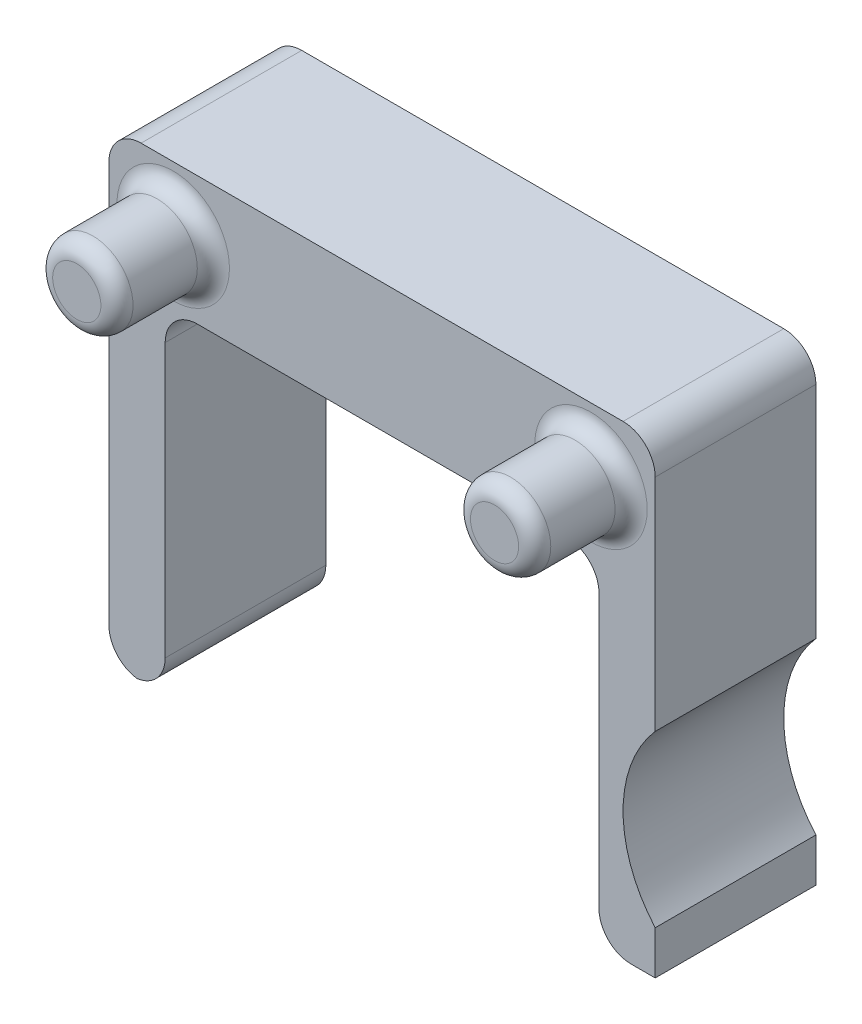
ISO-10303-21;
HEADER;
FILE_DESCRIPTION(('STEP AP214'),'2;1');
FILE_NAME('part.step','',(''),(''),'','','');
FILE_SCHEMA(('AUTOMOTIVE_DESIGN { 1 0 10303 214 1 1 1 1 }'));
ENDSEC;
DATA;
#1=APPLICATION_CONTEXT('core data for automotive mechanical design processes');
#2=APPLICATION_PROTOCOL_DEFINITION('international standard','automotive_design',2000,#1);
#3=PRODUCT_CONTEXT('',#1,'mechanical');
#4=PRODUCT('Part','Part','',(#3));
#5=PRODUCT_RELATED_PRODUCT_CATEGORY('part','',(#4));
#6=PRODUCT_DEFINITION_FORMATION('','',#4);
#7=PRODUCT_DEFINITION_CONTEXT('part definition',#1,'design');
#8=PRODUCT_DEFINITION('design','',#6,#7);
#9=PRODUCT_DEFINITION_SHAPE('','',#8);
#10=(LENGTH_UNIT() NAMED_UNIT(*) SI_UNIT(.MILLI.,.METRE.));
#11=(NAMED_UNIT(*) PLANE_ANGLE_UNIT() SI_UNIT($,.RADIAN.));
#12=(NAMED_UNIT(*) SI_UNIT($,.STERADIAN.) SOLID_ANGLE_UNIT());
#13=UNCERTAINTY_MEASURE_WITH_UNIT(LENGTH_MEASURE(1.E-05),#10,'distance_accuracy_value','');
#14=(GEOMETRIC_REPRESENTATION_CONTEXT(3) GLOBAL_UNCERTAINTY_ASSIGNED_CONTEXT((#13)) GLOBAL_UNIT_ASSIGNED_CONTEXT((#10,
#11,#12)) REPRESENTATION_CONTEXT('',''));
#15=CARTESIAN_POINT('',(0.,0.,0.));
#16=DIRECTION('',(0.,0.,1.));
#17=DIRECTION('',(1.,0.,0.));
#18=AXIS2_PLACEMENT_3D('',#15,#16,#17);
#19=CARTESIAN_POINT('',(10.1036821705426,-4.88441860465116,5.));
#20=DIRECTION('',(0.,0.,1.));
#21=DIRECTION('',(1.,0.,0.));
#22=AXIS2_PLACEMENT_3D('',#19,#20,#21);
#23=PLANE('',#22);
#24=CARTESIAN_POINT('',(5.10368217054263,3.61558139534884,5.));
#25=DIRECTION('',(0.,0.,1.));
#26=DIRECTION('',(1.,0.,0.));
#27=AXIS2_PLACEMENT_3D('',#24,#25,#26);
#28=CIRCLE('',#27,1.75);
#29=CARTESIAN_POINT('',(6.85368217054263,3.61558139534884,5.));
#30=VERTEX_POINT('',#29);
#31=EDGE_CURVE('E11',#30,#30,#28,.F.);
#32=ORIENTED_EDGE('',*,*,#31,.T.);
#33=EDGE_LOOP('',(#32));
#34=FACE_BOUND('',#33,.T.);
#35=CARTESIAN_POINT('',(-7.89631782945737,3.61558139534884,5.));
#36=DIRECTION('',(0.,0.,1.));
#37=DIRECTION('',(1.,0.,0.));
#38=AXIS2_PLACEMENT_3D('',#35,#36,#37);
#39=CIRCLE('',#38,1.75);
#40=CARTESIAN_POINT('',(-6.14631782945737,3.61558139534884,5.));
#41=VERTEX_POINT('',#40);
#42=EDGE_CURVE('E52',#41,#41,#39,.F.);
#43=ORIENTED_EDGE('',*,*,#42,.T.);
#44=EDGE_LOOP('',(#43));
#45=FACE_BOUND('',#44,.T.);
#46=DIRECTION('',(-1.,0.,0.));
#47=VECTOR('',#46,1.);
#48=CARTESIAN_POINT('',(-9.89631782945736,5.61558139534884,5.));
#49=LINE('',#48,#47);
#50=CARTESIAN_POINT('',(6.10368217054263,5.61558139534884,5.));
#51=VERTEX_POINT('',#50);
#52=CARTESIAN_POINT('',(-8.89631782945736,5.61558139534884,5.));
#53=VERTEX_POINT('',#52);
#54=EDGE_CURVE('E198',#51,#53,#49,.T.);
#55=ORIENTED_EDGE('',*,*,#54,.T.);
#56=CARTESIAN_POINT('',(-8.89631782945736,4.61558139534884,5.));
#57=DIRECTION('',(0.,0.,1.));
#58=DIRECTION('',(1.,0.,0.));
#59=AXIS2_PLACEMENT_3D('',#56,#57,#58);
#60=CIRCLE('',#59,1.);
#61=CARTESIAN_POINT('',(-9.89631782945736,4.61558139534884,5.));
#62=VERTEX_POINT('',#61);
#63=EDGE_CURVE('E284',#53,#62,#60,.T.);
#64=ORIENTED_EDGE('',*,*,#63,.T.);
#65=DIRECTION('',(0.,-1.,0.));
#66=VECTOR('',#65,1.);
#67=CARTESIAN_POINT('',(-9.89631782945736,-8.88441860465116,5.));
#68=LINE('',#67,#66);
#69=CARTESIAN_POINT('',(-9.89631782945736,-7.88441860465116,5.));
#70=VERTEX_POINT('',#69);
#71=EDGE_CURVE('E201',#62,#70,#68,.T.);
#72=ORIENTED_EDGE('',*,*,#71,.T.);
#73=CARTESIAN_POINT('',(-8.89631782945736,-7.88441860465116,5.));
#74=DIRECTION('',(0.,0.,1.));
#75=DIRECTION('',(1.,0.,0.));
#76=AXIS2_PLACEMENT_3D('',#73,#74,#75);
#77=CIRCLE('',#76,1.);
#78=CARTESIAN_POINT('',(-9.02131782945735,-8.87657534630038,5.));
#79=VERTEX_POINT('',#78);
#80=EDGE_CURVE('E59',#70,#79,#77,.T.);
#81=ORIENTED_EDGE('',*,*,#80,.T.);
#82=CARTESIAN_POINT('',(-9.14631782945736,-7.88441860465116,5.));
#83=DIRECTION('',(0.,0.,1.));
#84=DIRECTION('',(1.,0.,0.));
#85=AXIS2_PLACEMENT_3D('',#82,#83,#84);
#86=CIRCLE('',#85,1.);
#87=CARTESIAN_POINT('',(-8.14631782945736,-7.88441860465116,5.));
#88=VERTEX_POINT('',#87);
#89=EDGE_CURVE('E276',#79,#88,#86,.T.);
#90=ORIENTED_EDGE('',*,*,#89,.T.);
#91=DIRECTION('',(0.,1.,0.));
#92=VECTOR('',#91,1.);
#93=CARTESIAN_POINT('',(-8.14631782945736,1.61558139534884,5.));
#94=LINE('',#93,#92);
#95=CARTESIAN_POINT('',(-8.14631782945736,0.615581395348841,5.));
#96=VERTEX_POINT('',#95);
#97=EDGE_CURVE('E204',#88,#96,#94,.T.);
#98=ORIENTED_EDGE('',*,*,#97,.T.);
#99=CARTESIAN_POINT('',(-7.14631782945736,0.615581395348841,5.));
#100=DIRECTION('',(0.,0.,1.));
#101=DIRECTION('',(1.,0.,0.));
#102=AXIS2_PLACEMENT_3D('',#99,#100,#101);
#103=CIRCLE('',#102,1.);
#104=CARTESIAN_POINT('',(-7.14631782945736,1.61558139534884,5.));
#105=VERTEX_POINT('',#104);
#106=EDGE_CURVE('E316',#96,#105,#103,.F.);
#107=ORIENTED_EDGE('',*,*,#106,.T.);
#108=DIRECTION('',(1.,0.,0.));
#109=VECTOR('',#108,1.);
#110=CARTESIAN_POINT('',(5.35368217054264,1.61558139534884,5.));
#111=LINE('',#110,#109);
#112=CARTESIAN_POINT('',(4.35368217054264,1.61558139534884,5.));
#113=VERTEX_POINT('',#112);
#114=EDGE_CURVE('E240',#105,#113,#111,.T.);
#115=ORIENTED_EDGE('',*,*,#114,.T.);
#116=CARTESIAN_POINT('',(4.35368217054264,0.615581395348841,5.));
#117=DIRECTION('',(0.,0.,1.));
#118=DIRECTION('',(1.,0.,0.));
#119=AXIS2_PLACEMENT_3D('',#116,#117,#118);
#120=CIRCLE('',#119,1.);
#121=CARTESIAN_POINT('',(5.35368217054264,0.615581395348841,5.));
#122=VERTEX_POINT('',#121);
#123=EDGE_CURVE('E322',#113,#122,#120,.F.);
#124=ORIENTED_EDGE('',*,*,#123,.T.);
#125=DIRECTION('',(0.,-1.,0.));
#126=VECTOR('',#125,1.);
#127=CARTESIAN_POINT('',(5.35368217054264,-8.88441860465116,5.));
#128=LINE('',#127,#126);
#129=CARTESIAN_POINT('',(5.35368217054264,-7.88441860465116,5.));
#130=VERTEX_POINT('',#129);
#131=EDGE_CURVE('E171',#122,#130,#128,.T.);
#132=ORIENTED_EDGE('',*,*,#131,.T.);
#133=CARTESIAN_POINT('',(6.35368217054264,-7.88441860465116,5.));
#134=DIRECTION('',(0.,0.,1.));
#135=DIRECTION('',(1.,0.,0.));
#136=AXIS2_PLACEMENT_3D('',#133,#134,#135);
#137=CIRCLE('',#136,1.);
#138=CARTESIAN_POINT('',(6.35368217054263,-8.88441860465116,5.));
#139=VERTEX_POINT('',#138);
#140=EDGE_CURVE('E166',#130,#139,#137,.T.);
#141=ORIENTED_EDGE('',*,*,#140,.T.);
#142=DIRECTION('',(1.,0.,0.));
#143=VECTOR('',#142,1.);
#144=CARTESIAN_POINT('',(7.10368217054264,-8.88441860465116,5.));
#145=LINE('',#144,#143);
#146=CARTESIAN_POINT('',(7.10368217054264,-8.88441860465116,5.));
#147=VERTEX_POINT('',#146);
#148=EDGE_CURVE('E158',#139,#147,#145,.T.);
#149=ORIENTED_EDGE('',*,*,#148,.T.);
#150=DIRECTION('',(0.,1.,0.));
#151=VECTOR('',#150,1.);
#152=CARTESIAN_POINT('',(7.10368217054263,-7.53016991571575,5.));
#153=LINE('',#152,#151);
#154=CARTESIAN_POINT('',(7.10368217054263,-7.53016991571575,5.));
#155=VERTEX_POINT('',#154);
#156=EDGE_CURVE('E162',#147,#155,#153,.T.);
#157=ORIENTED_EDGE('',*,*,#156,.T.);
#158=CARTESIAN_POINT('',(10.1036821705426,-4.88441860465116,5.));
#159=DIRECTION('',(0.,0.,-1.));
#160=DIRECTION('',(1.,0.,0.));
#161=AXIS2_PLACEMENT_3D('',#158,#159,#160);
#162=CIRCLE('',#161,4.);
#163=CARTESIAN_POINT('',(7.10368217054263,-2.23866729358657,5.));
#164=VERTEX_POINT('',#163);
#165=EDGE_CURVE('E188',#155,#164,#162,.T.);
#166=ORIENTED_EDGE('',*,*,#165,.T.);
#167=DIRECTION('',(0.,1.,0.));
#168=VECTOR('',#167,1.);
#169=CARTESIAN_POINT('',(7.10368217054263,5.61558139534884,5.));
#170=LINE('',#169,#168);
#171=CARTESIAN_POINT('',(7.10368217054263,4.61558139534884,5.));
#172=VERTEX_POINT('',#171);
#173=EDGE_CURVE('E191',#164,#172,#170,.T.);
#174=ORIENTED_EDGE('',*,*,#173,.T.);
#175=CARTESIAN_POINT('',(6.10368217054263,4.61558139534884,5.));
#176=DIRECTION('',(0.,0.,1.));
#177=DIRECTION('',(1.,0.,0.));
#178=AXIS2_PLACEMENT_3D('',#175,#176,#177);
#179=CIRCLE('',#178,1.);
#180=EDGE_CURVE('E281',#172,#51,#179,.T.);
#181=ORIENTED_EDGE('',*,*,#180,.T.);
#182=EDGE_LOOP('',(#55,#64,#72,#81,#90,#98,#107,#115,#124,#132,#141,#149,#157,#166,#174,#181));
#183=FACE_BOUND('',#182,.T.);
#184=ADVANCED_FACE('F43',(#34,#45,#183),#23,.T.);
#185=CARTESIAN_POINT('',(10.1036821705426,-4.88441860465116,0.));
#186=DIRECTION('',(0.,0.,1.));
#187=DIRECTION('',(1.,0.,0.));
#188=AXIS2_PLACEMENT_3D('',#185,#186,#187);
#189=PLANE('',#188);
#190=DIRECTION('',(0.,-1.,0.));
#191=VECTOR('',#190,1.);
#192=CARTESIAN_POINT('',(-9.89631782945736,-8.88441860465116,0.));
#193=LINE('',#192,#191);
#194=CARTESIAN_POINT('',(-9.89631782945736,4.61558139534884,0.));
#195=VERTEX_POINT('',#194);
#196=CARTESIAN_POINT('',(-9.89631782945736,-7.88441860465116,0.));
#197=VERTEX_POINT('',#196);
#198=EDGE_CURVE('E233',#195,#197,#193,.T.);
#199=ORIENTED_EDGE('',*,*,#198,.F.);
#200=CARTESIAN_POINT('',(-8.89631782945736,4.61558139534884,0.));
#201=DIRECTION('',(0.,0.,1.));
#202=DIRECTION('',(1.,0.,0.));
#203=AXIS2_PLACEMENT_3D('',#200,#201,#202);
#204=CIRCLE('',#203,1.);
#205=CARTESIAN_POINT('',(-8.89631782945736,5.61558139534884,0.));
#206=VERTEX_POINT('',#205);
#207=EDGE_CURVE('E264',#195,#206,#204,.F.);
#208=ORIENTED_EDGE('',*,*,#207,.T.);
#209=DIRECTION('',(-1.,0.,0.));
#210=VECTOR('',#209,1.);
#211=CARTESIAN_POINT('',(-9.89631782945736,5.61558139534884,0.));
#212=LINE('',#211,#210);
#213=CARTESIAN_POINT('',(6.10368217054263,5.61558139534884,0.));
#214=VERTEX_POINT('',#213);
#215=EDGE_CURVE('E229',#214,#206,#212,.T.);
#216=ORIENTED_EDGE('',*,*,#215,.F.);
#217=CARTESIAN_POINT('',(6.10368217054263,4.61558139534884,0.));
#218=DIRECTION('',(0.,0.,1.));
#219=DIRECTION('',(1.,0.,0.));
#220=AXIS2_PLACEMENT_3D('',#217,#218,#219);
#221=CIRCLE('',#220,1.);
#222=CARTESIAN_POINT('',(7.10368217054263,4.61558139534884,0.));
#223=VERTEX_POINT('',#222);
#224=EDGE_CURVE('E261',#214,#223,#221,.F.);
#225=ORIENTED_EDGE('',*,*,#224,.T.);
#226=DIRECTION('',(0.,1.,0.));
#227=VECTOR('',#226,1.);
#228=CARTESIAN_POINT('',(7.10368217054263,5.61558139534884,0.));
#229=LINE('',#228,#227);
#230=CARTESIAN_POINT('',(7.10368217054263,-2.23866729358657,0.));
#231=VERTEX_POINT('',#230);
#232=EDGE_CURVE('E225',#231,#223,#229,.T.);
#233=ORIENTED_EDGE('',*,*,#232,.F.);
#234=CARTESIAN_POINT('',(10.1036821705426,-4.88441860465116,0.));
#235=DIRECTION('',(0.,0.,-1.));
#236=DIRECTION('',(1.,0.,0.));
#237=AXIS2_PLACEMENT_3D('',#234,#235,#236);
#238=CIRCLE('',#237,4.);
#239=CARTESIAN_POINT('',(7.10368217054263,-7.53016991571575,0.));
#240=VERTEX_POINT('',#239);
#241=EDGE_CURVE('E222',#240,#231,#238,.T.);
#242=ORIENTED_EDGE('',*,*,#241,.F.);
#243=DIRECTION('',(0.,1.,0.));
#244=VECTOR('',#243,1.);
#245=CARTESIAN_POINT('',(7.10368217054263,-7.53016991571575,0.));
#246=LINE('',#245,#244);
#247=CARTESIAN_POINT('',(7.10368217054264,-8.88441860465116,0.));
#248=VERTEX_POINT('',#247);
#249=EDGE_CURVE('E219',#248,#240,#246,.T.);
#250=ORIENTED_EDGE('',*,*,#249,.F.);
#251=DIRECTION('',(1.,0.,0.));
#252=VECTOR('',#251,1.);
#253=CARTESIAN_POINT('',(7.10368217054264,-8.88441860465116,0.));
#254=LINE('',#253,#252);
#255=CARTESIAN_POINT('',(6.35368217054263,-8.88441860465116,0.));
#256=VERTEX_POINT('',#255);
#257=EDGE_CURVE('E177',#256,#248,#254,.T.);
#258=ORIENTED_EDGE('',*,*,#257,.F.);
#259=CARTESIAN_POINT('',(6.35368217054264,-7.88441860465116,0.));
#260=DIRECTION('',(0.,0.,1.));
#261=DIRECTION('',(1.,0.,0.));
#262=AXIS2_PLACEMENT_3D('',#259,#260,#261);
#263=CIRCLE('',#262,1.);
#264=CARTESIAN_POINT('',(5.35368217054264,-7.88441860465116,0.));
#265=VERTEX_POINT('',#264);
#266=EDGE_CURVE('E258',#256,#265,#263,.F.);
#267=ORIENTED_EDGE('',*,*,#266,.T.);
#268=DIRECTION('',(0.,-1.,0.));
#269=VECTOR('',#268,1.);
#270=CARTESIAN_POINT('',(5.35368217054264,-8.88441860465116,0.));
#271=LINE('',#270,#269);
#272=CARTESIAN_POINT('',(5.35368217054264,0.615581395348841,0.));
#273=VERTEX_POINT('',#272);
#274=EDGE_CURVE('E212',#273,#265,#271,.T.);
#275=ORIENTED_EDGE('',*,*,#274,.F.);
#276=CARTESIAN_POINT('',(4.35368217054264,0.615581395348841,0.));
#277=DIRECTION('',(0.,0.,1.));
#278=DIRECTION('',(1.,0.,0.));
#279=AXIS2_PLACEMENT_3D('',#276,#277,#278);
#280=CIRCLE('',#279,1.);
#281=CARTESIAN_POINT('',(4.35368217054264,1.61558139534884,0.));
#282=VERTEX_POINT('',#281);
#283=EDGE_CURVE('E319',#273,#282,#280,.T.);
#284=ORIENTED_EDGE('',*,*,#283,.T.);
#285=DIRECTION('',(1.,0.,0.));
#286=VECTOR('',#285,1.);
#287=CARTESIAN_POINT('',(5.35368217054264,1.61558139534884,0.));
#288=LINE('',#287,#286);
#289=CARTESIAN_POINT('',(-7.14631782945736,1.61558139534884,0.));
#290=VERTEX_POINT('',#289);
#291=EDGE_CURVE('E208',#290,#282,#288,.T.);
#292=ORIENTED_EDGE('',*,*,#291,.F.);
#293=CARTESIAN_POINT('',(-7.14631782945736,0.615581395348841,0.));
#294=DIRECTION('',(0.,0.,1.));
#295=DIRECTION('',(1.,0.,0.));
#296=AXIS2_PLACEMENT_3D('',#293,#294,#295);
#297=CIRCLE('',#296,1.);
#298=CARTESIAN_POINT('',(-8.14631782945736,0.615581395348841,0.));
#299=VERTEX_POINT('',#298);
#300=EDGE_CURVE('E313',#290,#299,#297,.T.);
#301=ORIENTED_EDGE('',*,*,#300,.T.);
#302=DIRECTION('',(0.,1.,0.));
#303=VECTOR('',#302,1.);
#304=CARTESIAN_POINT('',(-8.14631782945736,1.61558139534884,0.));
#305=LINE('',#304,#303);
#306=CARTESIAN_POINT('',(-8.14631782945736,-7.88441860465116,0.));
#307=VERTEX_POINT('',#306);
#308=EDGE_CURVE('E237',#307,#299,#305,.T.);
#309=ORIENTED_EDGE('',*,*,#308,.F.);
#310=CARTESIAN_POINT('',(-9.14631782945736,-7.88441860465116,0.));
#311=DIRECTION('',(0.,0.,1.));
#312=DIRECTION('',(1.,0.,0.));
#313=AXIS2_PLACEMENT_3D('',#310,#311,#312);
#314=CIRCLE('',#313,1.);
#315=CARTESIAN_POINT('',(-9.02131782945735,-8.87657534630038,0.));
#316=VERTEX_POINT('',#315);
#317=EDGE_CURVE('E255',#307,#316,#314,.F.);
#318=ORIENTED_EDGE('',*,*,#317,.T.);
#319=CARTESIAN_POINT('',(-8.89631782945736,-7.88441860465116,0.));
#320=DIRECTION('',(0.,0.,1.));
#321=DIRECTION('',(1.,0.,0.));
#322=AXIS2_PLACEMENT_3D('',#319,#320,#321);
#323=CIRCLE('',#322,1.);
#324=EDGE_CURVE('E252',#316,#197,#323,.F.);
#325=ORIENTED_EDGE('',*,*,#324,.T.);
#326=EDGE_LOOP('',(#199,#208,#216,#225,#233,#242,#250,#258,#267,#275,#284,#292,#301,#309,#318,#325));
#327=FACE_BOUND('',#326,.T.);
#328=ADVANCED_FACE('F378',(#327),#189,.F.);
#329=CARTESIAN_POINT('',(5.35368217054264,1.61558139534884,5.));
#330=DIRECTION('',(0.,1.,0.));
#331=DIRECTION('',(-1.,0.,0.));
#332=AXIS2_PLACEMENT_3D('',#329,#330,#331);
#333=PLANE('',#332);
#334=ORIENTED_EDGE('',*,*,#114,.F.);
#335=DIRECTION('',(0.,0.,-1.));
#336=VECTOR('',#335,1.);
#337=CARTESIAN_POINT('',(-7.14631782945736,1.61558139534884,0.));
#338=LINE('',#337,#336);
#339=EDGE_CURVE('E293',#105,#290,#338,.T.);
#340=ORIENTED_EDGE('',*,*,#339,.T.);
#341=ORIENTED_EDGE('',*,*,#291,.T.);
#342=DIRECTION('',(0.,0.,-1.));
#343=VECTOR('',#342,1.);
#344=CARTESIAN_POINT('',(4.35368217054264,1.61558139534884,5.));
#345=LINE('',#344,#343);
#346=EDGE_CURVE('E290',#282,#113,#345,.F.);
#347=ORIENTED_EDGE('',*,*,#346,.T.);
#348=EDGE_LOOP('',(#334,#340,#341,#347));
#349=FACE_BOUND('',#348,.T.);
#350=ADVANCED_FACE('F383',(#349),#333,.F.);
#351=CARTESIAN_POINT('',(5.35368217054264,-8.88441860465116,5.));
#352=DIRECTION('',(1.,0.,0.));
#353=DIRECTION('',(0.,0.,-1.));
#354=AXIS2_PLACEMENT_3D('',#351,#352,#353);
#355=PLANE('',#354);
#356=ORIENTED_EDGE('',*,*,#131,.F.);
#357=DIRECTION('',(0.,0.,-1.));
#358=VECTOR('',#357,1.);
#359=CARTESIAN_POINT('',(5.35368217054264,0.615581395348841,0.));
#360=LINE('',#359,#358);
#361=EDGE_CURVE('E306',#122,#273,#360,.T.);
#362=ORIENTED_EDGE('',*,*,#361,.T.);
#363=ORIENTED_EDGE('',*,*,#274,.T.);
#364=DIRECTION('',(0.,0.,-1.));
#365=VECTOR('',#364,1.);
#366=CARTESIAN_POINT('',(5.35368217054264,-7.88441860465116,5.));
#367=LINE('',#366,#365);
#368=EDGE_CURVE('E303',#265,#130,#367,.F.);
#369=ORIENTED_EDGE('',*,*,#368,.T.);
#370=EDGE_LOOP('',(#356,#362,#363,#369));
#371=FACE_BOUND('',#370,.T.);
#372=ADVANCED_FACE('F406',(#371),#355,.F.);
#373=CARTESIAN_POINT('',(7.10368217054264,-8.88441860465116,5.));
#374=DIRECTION('',(0.,1.,0.));
#375=DIRECTION('',(-1.,0.,0.));
#376=AXIS2_PLACEMENT_3D('',#373,#374,#375);
#377=PLANE('',#376);
#378=ORIENTED_EDGE('',*,*,#148,.F.);
#379=DIRECTION('',(0.,0.,-1.));
#380=VECTOR('',#379,1.);
#381=CARTESIAN_POINT('',(6.35368217054263,-8.88441860465116,5.));
#382=LINE('',#381,#380);
#383=EDGE_CURVE('E310',#139,#256,#382,.T.);
#384=ORIENTED_EDGE('',*,*,#383,.T.);
#385=ORIENTED_EDGE('',*,*,#257,.T.);
#386=DIRECTION('',(0.,0.,-1.));
#387=VECTOR('',#386,1.);
#388=CARTESIAN_POINT('',(7.10368217054264,-8.88441860465116,5.));
#389=LINE('',#388,#387);
#390=EDGE_CURVE('E174',#147,#248,#389,.T.);
#391=ORIENTED_EDGE('',*,*,#390,.F.);
#392=EDGE_LOOP('',(#378,#384,#385,#391));
#393=FACE_BOUND('',#392,.T.);
#394=ADVANCED_FACE('F175',(#393),#377,.F.);
#395=CARTESIAN_POINT('',(7.10368217054263,-7.53016991571575,5.));
#396=DIRECTION('',(-1.,0.,0.));
#397=DIRECTION('',(0.,-1.,0.));
#398=AXIS2_PLACEMENT_3D('',#395,#396,#397);
#399=PLANE('',#398);
#400=ORIENTED_EDGE('',*,*,#249,.T.);
#401=DIRECTION('',(0.,0.,-1.));
#402=VECTOR('',#401,1.);
#403=CARTESIAN_POINT('',(7.10368217054263,-7.53016991571575,5.));
#404=LINE('',#403,#402);
#405=EDGE_CURVE('E182',#155,#240,#404,.T.);
#406=ORIENTED_EDGE('',*,*,#405,.F.);
#407=ORIENTED_EDGE('',*,*,#156,.F.);
#408=ORIENTED_EDGE('',*,*,#390,.T.);
#409=EDGE_LOOP('',(#400,#406,#407,#408));
#410=FACE_BOUND('',#409,.T.);
#411=ADVANCED_FACE('F184',(#410),#399,.F.);
#412=CARTESIAN_POINT('',(10.1036821705426,-4.88441860465116,5.));
#413=DIRECTION('',(0.,0.,-1.));
#414=DIRECTION('',(-1.,0.,0.));
#415=AXIS2_PLACEMENT_3D('',#412,#413,#414);
#416=CYLINDRICAL_SURFACE('',#415,4.);
#417=ORIENTED_EDGE('',*,*,#241,.T.);
#418=DIRECTION('',(0.,0.,-1.));
#419=VECTOR('',#418,1.);
#420=CARTESIAN_POINT('',(7.10368217054263,-2.23866729358657,5.));
#421=LINE('',#420,#419);
#422=EDGE_CURVE('E207',#164,#231,#421,.T.);
#423=ORIENTED_EDGE('',*,*,#422,.F.);
#424=ORIENTED_EDGE('',*,*,#165,.F.);
#425=ORIENTED_EDGE('',*,*,#405,.T.);
#426=EDGE_LOOP('',(#417,#423,#424,#425));
#427=FACE_BOUND('',#426,.T.);
#428=ADVANCED_FACE('F397',(#427),#416,.F.);
#429=CARTESIAN_POINT('',(7.10368217054263,5.61558139534884,5.));
#430=DIRECTION('',(-1.,0.,0.));
#431=DIRECTION('',(0.,-1.,0.));
#432=AXIS2_PLACEMENT_3D('',#429,#430,#431);
#433=PLANE('',#432);
#434=ORIENTED_EDGE('',*,*,#232,.T.);
#435=DIRECTION('',(0.,0.,-1.));
#436=VECTOR('',#435,1.);
#437=CARTESIAN_POINT('',(7.10368217054263,4.61558139534884,5.));
#438=LINE('',#437,#436);
#439=EDGE_CURVE('E287',#223,#172,#438,.F.);
#440=ORIENTED_EDGE('',*,*,#439,.T.);
#441=ORIENTED_EDGE('',*,*,#173,.F.);
#442=ORIENTED_EDGE('',*,*,#422,.T.);
#443=EDGE_LOOP('',(#434,#440,#441,#442));
#444=FACE_BOUND('',#443,.T.);
#445=ADVANCED_FACE('F393',(#444),#433,.F.);
#446=CARTESIAN_POINT('',(-9.89631782945736,5.61558139534884,5.));
#447=DIRECTION('',(0.,-1.,0.));
#448=DIRECTION('',(1.,0.,0.));
#449=AXIS2_PLACEMENT_3D('',#446,#447,#448);
#450=PLANE('',#449);
#451=ORIENTED_EDGE('',*,*,#215,.T.);
#452=DIRECTION('',(0.,0.,-1.));
#453=VECTOR('',#452,1.);
#454=CARTESIAN_POINT('',(-8.89631782945736,5.61558139534884,5.));
#455=LINE('',#454,#453);
#456=EDGE_CURVE('E271',#206,#53,#455,.F.);
#457=ORIENTED_EDGE('',*,*,#456,.T.);
#458=ORIENTED_EDGE('',*,*,#54,.F.);
#459=DIRECTION('',(0.,0.,-1.));
#460=VECTOR('',#459,1.);
#461=CARTESIAN_POINT('',(6.10368217054263,5.61558139534884,5.));
#462=LINE('',#461,#460);
#463=EDGE_CURVE('E267',#51,#214,#462,.T.);
#464=ORIENTED_EDGE('',*,*,#463,.T.);
#465=EDGE_LOOP('',(#451,#457,#458,#464));
#466=FACE_BOUND('',#465,.T.);
#467=ADVANCED_FACE('F389',(#466),#450,.F.);
#468=CARTESIAN_POINT('',(-9.89631782945736,-8.88441860465116,5.));
#469=DIRECTION('',(1.,0.,0.));
#470=DIRECTION('',(0.,0.,-1.));
#471=AXIS2_PLACEMENT_3D('',#468,#469,#470);
#472=PLANE('',#471);
#473=ORIENTED_EDGE('',*,*,#71,.F.);
#474=DIRECTION('',(0.,0.,-1.));
#475=VECTOR('',#474,1.);
#476=CARTESIAN_POINT('',(-9.89631782945736,4.61558139534884,5.));
#477=LINE('',#476,#475);
#478=EDGE_CURVE('E248',#62,#195,#477,.T.);
#479=ORIENTED_EDGE('',*,*,#478,.T.);
#480=ORIENTED_EDGE('',*,*,#198,.T.);
#481=DIRECTION('',(0.,0.,-1.));
#482=VECTOR('',#481,1.);
#483=CARTESIAN_POINT('',(-9.89631782945736,-7.88441860465116,5.));
#484=LINE('',#483,#482);
#485=EDGE_CURVE('E181',#197,#70,#484,.F.);
#486=ORIENTED_EDGE('',*,*,#485,.T.);
#487=EDGE_LOOP('',(#473,#479,#480,#486));
#488=FACE_BOUND('',#487,.T.);
#489=ADVANCED_FACE('F374',(#488),#472,.F.);
#490=CARTESIAN_POINT('',(-8.14631782945736,1.61558139534884,5.));
#491=DIRECTION('',(-1.,0.,0.));
#492=DIRECTION('',(0.,-1.,0.));
#493=AXIS2_PLACEMENT_3D('',#490,#491,#492);
#494=PLANE('',#493);
#495=ORIENTED_EDGE('',*,*,#308,.T.);
#496=DIRECTION('',(0.,0.,-1.));
#497=VECTOR('',#496,1.);
#498=CARTESIAN_POINT('',(-8.14631782945736,0.615581395348841,5.));
#499=LINE('',#498,#497);
#500=EDGE_CURVE('E67',#299,#96,#499,.F.);
#501=ORIENTED_EDGE('',*,*,#500,.T.);
#502=ORIENTED_EDGE('',*,*,#97,.F.);
#503=DIRECTION('',(0.,0.,-1.));
#504=VECTOR('',#503,1.);
#505=CARTESIAN_POINT('',(-8.14631782945736,-7.88441860465116,5.));
#506=LINE('',#505,#504);
#507=EDGE_CURVE('E297',#88,#307,#506,.T.);
#508=ORIENTED_EDGE('',*,*,#507,.T.);
#509=EDGE_LOOP('',(#495,#501,#502,#508));
#510=FACE_BOUND('',#509,.T.);
#511=ADVANCED_FACE('F364',(#510),#494,.F.);
#512=CARTESIAN_POINT('',(-7.89631782945737,3.61558139534884,0.));
#513=DIRECTION('',(0.,0.,1.));
#514=DIRECTION('',(1.,0.,0.));
#515=AXIS2_PLACEMENT_3D('',#512,#513,#514);
#516=CYLINDRICAL_SURFACE('',#515,1.25);
#517=CARTESIAN_POINT('',(-7.89631782945737,3.61558139534884,7.5));
#518=DIRECTION('',(0.,0.,1.));
#519=DIRECTION('',(1.,0.,0.));
#520=AXIS2_PLACEMENT_3D('',#517,#518,#519);
#521=CIRCLE('',#520,1.25);
#522=CARTESIAN_POINT('',(-6.64631782945737,3.61558139534884,7.5));
#523=VERTEX_POINT('',#522);
#524=EDGE_CURVE('E348',#523,#523,#521,.F.);
#525=ORIENTED_EDGE('',*,*,#524,.T.);
#526=EDGE_LOOP('',(#525));
#527=FACE_BOUND('',#526,.T.);
#528=CARTESIAN_POINT('',(-7.89631782945737,3.61558139534884,5.5));
#529=DIRECTION('',(0.,0.,1.));
#530=DIRECTION('',(1.,0.,0.));
#531=AXIS2_PLACEMENT_3D('',#528,#529,#530);
#532=CIRCLE('',#531,1.25);
#533=CARTESIAN_POINT('',(-6.64631782945737,3.61558139534884,5.5));
#534=VERTEX_POINT('',#533);
#535=EDGE_CURVE('E344',#534,#534,#532,.T.);
#536=ORIENTED_EDGE('',*,*,#535,.T.);
#537=EDGE_LOOP('',(#536));
#538=FACE_BOUND('',#537,.T.);
#539=ADVANCED_FACE('F361',(#527,#538),#516,.T.);
#540=CARTESIAN_POINT('',(-7.89631782945737,3.61558139534884,8.));
#541=DIRECTION('',(0.,0.,1.));
#542=DIRECTION('',(1.,0.,0.));
#543=AXIS2_PLACEMENT_3D('',#540,#541,#542);
#544=PLANE('',#543);
#545=CARTESIAN_POINT('',(-7.89631782945737,3.61558139534884,8.));
#546=DIRECTION('',(0.,0.,1.));
#547=DIRECTION('',(1.,0.,0.));
#548=AXIS2_PLACEMENT_3D('',#545,#546,#547);
#549=CIRCLE('',#548,0.75);
#550=CARTESIAN_POINT('',(-7.14631782945737,3.61558139534884,8.));
#551=VERTEX_POINT('',#550);
#552=EDGE_CURVE('E340',#551,#551,#549,.T.);
#553=ORIENTED_EDGE('',*,*,#552,.T.);
#554=EDGE_LOOP('',(#553));
#555=FACE_BOUND('',#554,.T.);
#556=ADVANCED_FACE('F363',(#555),#544,.T.);
#557=CARTESIAN_POINT('',(5.10368217054263,3.61558139534884,0.));
#558=DIRECTION('',(0.,0.,1.));
#559=DIRECTION('',(1.,0.,0.));
#560=AXIS2_PLACEMENT_3D('',#557,#558,#559);
#561=CYLINDRICAL_SURFACE('',#560,1.25);
#562=CARTESIAN_POINT('',(5.10368217054263,3.61558139534884,7.5));
#563=DIRECTION('',(0.,0.,1.));
#564=DIRECTION('',(1.,0.,0.));
#565=AXIS2_PLACEMENT_3D('',#562,#563,#564);
#566=CIRCLE('',#565,1.25);
#567=CARTESIAN_POINT('',(6.35368217054263,3.61558139534884,7.5));
#568=VERTEX_POINT('',#567);
#569=EDGE_CURVE('E336',#568,#568,#566,.F.);
#570=ORIENTED_EDGE('',*,*,#569,.T.);
#571=EDGE_LOOP('',(#570));
#572=FACE_BOUND('',#571,.T.);
#573=CARTESIAN_POINT('',(5.10368217054263,3.61558139534884,5.5));
#574=DIRECTION('',(0.,0.,1.));
#575=DIRECTION('',(1.,0.,0.));
#576=AXIS2_PLACEMENT_3D('',#573,#574,#575);
#577=CIRCLE('',#576,1.25);
#578=CARTESIAN_POINT('',(6.35368217054263,3.61558139534884,5.5));
#579=VERTEX_POINT('',#578);
#580=EDGE_CURVE('E332',#579,#579,#577,.T.);
#581=ORIENTED_EDGE('',*,*,#580,.T.);
#582=EDGE_LOOP('',(#581));
#583=FACE_BOUND('',#582,.T.);
#584=ADVANCED_FACE('F371',(#572,#583),#561,.T.);
#585=CARTESIAN_POINT('',(5.10368217054263,3.61558139534884,8.));
#586=DIRECTION('',(0.,0.,1.));
#587=DIRECTION('',(1.,0.,0.));
#588=AXIS2_PLACEMENT_3D('',#585,#586,#587);
#589=PLANE('',#588);
#590=CARTESIAN_POINT('',(5.10368217054263,3.61558139534884,8.));
#591=DIRECTION('',(0.,0.,1.));
#592=DIRECTION('',(1.,0.,0.));
#593=AXIS2_PLACEMENT_3D('',#590,#591,#592);
#594=CIRCLE('',#593,0.75);
#595=CARTESIAN_POINT('',(5.85368217054263,3.61558139534884,8.));
#596=VERTEX_POINT('',#595);
#597=EDGE_CURVE('E325',#596,#596,#594,.T.);
#598=ORIENTED_EDGE('',*,*,#597,.T.);
#599=EDGE_LOOP('',(#598));
#600=FACE_BOUND('',#599,.T.);
#601=ADVANCED_FACE('F417',(#600),#589,.T.);
#602=CARTESIAN_POINT('',(-8.89631782945736,4.61558139534884,5.));
#603=DIRECTION('',(0.,0.,-1.));
#604=DIRECTION('',(-1.,0.,0.));
#605=AXIS2_PLACEMENT_3D('',#602,#603,#604);
#606=CYLINDRICAL_SURFACE('',#605,1.);
#607=ORIENTED_EDGE('',*,*,#63,.F.);
#608=ORIENTED_EDGE('',*,*,#456,.F.);
#609=ORIENTED_EDGE('',*,*,#207,.F.);
#610=ORIENTED_EDGE('',*,*,#478,.F.);
#611=EDGE_LOOP('',(#607,#608,#609,#610));
#612=FACE_BOUND('',#611,.T.);
#613=ADVANCED_FACE('F413',(#612),#606,.T.);
#614=CARTESIAN_POINT('',(6.10368217054263,4.61558139534884,5.));
#615=DIRECTION('',(0.,0.,-1.));
#616=DIRECTION('',(-1.,0.,0.));
#617=AXIS2_PLACEMENT_3D('',#614,#615,#616);
#618=CYLINDRICAL_SURFACE('',#617,1.);
#619=ORIENTED_EDGE('',*,*,#180,.F.);
#620=ORIENTED_EDGE('',*,*,#439,.F.);
#621=ORIENTED_EDGE('',*,*,#224,.F.);
#622=ORIENTED_EDGE('',*,*,#463,.F.);
#623=EDGE_LOOP('',(#619,#620,#621,#622));
#624=FACE_BOUND('',#623,.T.);
#625=ADVANCED_FACE('F416',(#624),#618,.T.);
#626=CARTESIAN_POINT('',(-7.14631782945736,0.615581395348841,5.));
#627=DIRECTION('',(0.,0.,1.));
#628=DIRECTION('',(1.,0.,0.));
#629=AXIS2_PLACEMENT_3D('',#626,#627,#628);
#630=CYLINDRICAL_SURFACE('',#629,1.);
#631=ORIENTED_EDGE('',*,*,#106,.F.);
#632=ORIENTED_EDGE('',*,*,#500,.F.);
#633=ORIENTED_EDGE('',*,*,#300,.F.);
#634=ORIENTED_EDGE('',*,*,#339,.F.);
#635=EDGE_LOOP('',(#631,#632,#633,#634));
#636=FACE_BOUND('',#635,.T.);
#637=ADVANCED_FACE('F421',(#636),#630,.F.);
#638=CARTESIAN_POINT('',(4.35368217054264,0.615581395348841,5.));
#639=DIRECTION('',(0.,0.,1.));
#640=DIRECTION('',(1.,0.,0.));
#641=AXIS2_PLACEMENT_3D('',#638,#639,#640);
#642=CYLINDRICAL_SURFACE('',#641,1.);
#643=ORIENTED_EDGE('',*,*,#123,.F.);
#644=ORIENTED_EDGE('',*,*,#346,.F.);
#645=ORIENTED_EDGE('',*,*,#283,.F.);
#646=ORIENTED_EDGE('',*,*,#361,.F.);
#647=EDGE_LOOP('',(#643,#644,#645,#646));
#648=FACE_BOUND('',#647,.T.);
#649=ADVANCED_FACE('F425',(#648),#642,.F.);
#650=CARTESIAN_POINT('',(6.35368217054264,-7.88441860465116,5.));
#651=DIRECTION('',(0.,0.,-1.));
#652=DIRECTION('',(-1.,0.,0.));
#653=AXIS2_PLACEMENT_3D('',#650,#651,#652);
#654=CYLINDRICAL_SURFACE('',#653,1.);
#655=ORIENTED_EDGE('',*,*,#140,.F.);
#656=ORIENTED_EDGE('',*,*,#368,.F.);
#657=ORIENTED_EDGE('',*,*,#266,.F.);
#658=ORIENTED_EDGE('',*,*,#383,.F.);
#659=EDGE_LOOP('',(#655,#656,#657,#658));
#660=FACE_BOUND('',#659,.T.);
#661=ADVANCED_FACE('F429',(#660),#654,.T.);
#662=CARTESIAN_POINT('',(-8.89631782945736,-7.88441860465116,5.));
#663=DIRECTION('',(0.,0.,-1.));
#664=DIRECTION('',(-1.,0.,0.));
#665=AXIS2_PLACEMENT_3D('',#662,#663,#664);
#666=CYLINDRICAL_SURFACE('',#665,1.);
#667=DIRECTION('',(0.,0.,-1.));
#668=VECTOR('',#667,1.);
#669=CARTESIAN_POINT('',(-9.02131782945735,-8.87657534630038,2.5));
#670=LINE('',#669,#668);
#671=EDGE_CURVE('E213',#79,#316,#670,.T.);
#672=ORIENTED_EDGE('',*,*,#671,.F.);
#673=ORIENTED_EDGE('',*,*,#80,.F.);
#674=ORIENTED_EDGE('',*,*,#485,.F.);
#675=ORIENTED_EDGE('',*,*,#324,.F.);
#676=EDGE_LOOP('',(#672,#673,#674,#675));
#677=FACE_BOUND('',#676,.T.);
#678=ADVANCED_FACE('F433',(#677),#666,.T.);
#679=CARTESIAN_POINT('',(-9.14631782945736,-7.88441860465116,5.));
#680=DIRECTION('',(0.,0.,-1.));
#681=DIRECTION('',(-1.,0.,0.));
#682=AXIS2_PLACEMENT_3D('',#679,#680,#681);
#683=CYLINDRICAL_SURFACE('',#682,1.);
#684=ORIENTED_EDGE('',*,*,#89,.F.);
#685=ORIENTED_EDGE('',*,*,#671,.T.);
#686=ORIENTED_EDGE('',*,*,#317,.F.);
#687=ORIENTED_EDGE('',*,*,#507,.F.);
#688=EDGE_LOOP('',(#684,#685,#686,#687));
#689=FACE_BOUND('',#688,.T.);
#690=ADVANCED_FACE('F435',(#689),#683,.T.);
#691=CARTESIAN_POINT('',(5.10368217054263,3.61558139534884,7.5));
#692=DIRECTION('',(0.,0.,1.));
#693=DIRECTION('',(1.,0.,0.));
#694=AXIS2_PLACEMENT_3D('',#691,#692,#693);
#695=TOROIDAL_SURFACE('',#694,0.75,0.5);
#696=ORIENTED_EDGE('',*,*,#569,.F.);
#697=EDGE_LOOP('',(#696));
#698=FACE_BOUND('',#697,.T.);
#699=ORIENTED_EDGE('',*,*,#597,.F.);
#700=EDGE_LOOP('',(#699));
#701=FACE_BOUND('',#700,.T.);
#702=ADVANCED_FACE('F438',(#698,#701),#695,.T.);
#703=CARTESIAN_POINT('',(-7.89631782945737,3.61558139534884,7.5));
#704=DIRECTION('',(0.,0.,1.));
#705=DIRECTION('',(1.,0.,0.));
#706=AXIS2_PLACEMENT_3D('',#703,#704,#705);
#707=TOROIDAL_SURFACE('',#706,0.75,0.5);
#708=ORIENTED_EDGE('',*,*,#524,.F.);
#709=EDGE_LOOP('',(#708));
#710=FACE_BOUND('',#709,.T.);
#711=ORIENTED_EDGE('',*,*,#552,.F.);
#712=EDGE_LOOP('',(#711));
#713=FACE_BOUND('',#712,.T.);
#714=ADVANCED_FACE('F445',(#710,#713),#707,.T.);
#715=CARTESIAN_POINT('',(5.10368217054263,3.61558139534884,5.5));
#716=DIRECTION('',(0.,0.,1.));
#717=DIRECTION('',(1.,0.,0.));
#718=AXIS2_PLACEMENT_3D('',#715,#716,#717);
#719=TOROIDAL_SURFACE('',#718,1.75,0.5);
#720=ORIENTED_EDGE('',*,*,#31,.F.);
#721=EDGE_LOOP('',(#720));
#722=FACE_BOUND('',#721,.T.);
#723=ORIENTED_EDGE('',*,*,#580,.F.);
#724=EDGE_LOOP('',(#723));
#725=FACE_BOUND('',#724,.T.);
#726=ADVANCED_FACE('F358',(#722,#725),#719,.F.);
#727=CARTESIAN_POINT('',(-7.89631782945737,3.61558139534884,5.5));
#728=DIRECTION('',(0.,0.,1.));
#729=DIRECTION('',(1.,0.,0.));
#730=AXIS2_PLACEMENT_3D('',#727,#728,#729);
#731=TOROIDAL_SURFACE('',#730,1.75,0.5);
#732=ORIENTED_EDGE('',*,*,#42,.F.);
#733=EDGE_LOOP('',(#732));
#734=FACE_BOUND('',#733,.T.);
#735=ORIENTED_EDGE('',*,*,#535,.F.);
#736=EDGE_LOOP('',(#735));
#737=FACE_BOUND('',#736,.T.);
#738=ADVANCED_FACE('F45',(#734,#737),#731,.F.);
#739=CLOSED_SHELL('',(#184,#328,#350,#372,#394,#411,#428,#445,#467,#489,#511,#539,#556,#584,
#601,#613,#625,#637,#649,#661,#678,#690,#702,#714,#726,#738));
#740=MANIFOLD_SOLID_BREP('B2',#739);
#741=ADVANCED_BREP_SHAPE_REPRESENTATION('',(#18,#740),#14);
#742=SHAPE_DEFINITION_REPRESENTATION(#9,#741);
ENDSEC;
END-ISO-10303-21;
